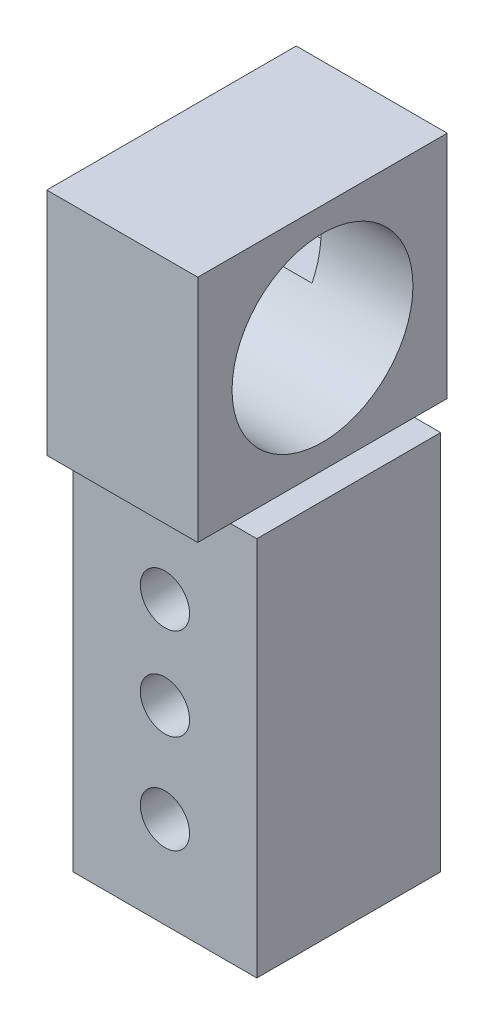
ISO-10303-21;
HEADER;
FILE_DESCRIPTION(('STEP AP214'),'2;1');
FILE_NAME('part.step','',(''),(''),'','','');
FILE_SCHEMA(('AUTOMOTIVE_DESIGN { 1 0 10303 214 1 1 1 1 }'));
ENDSEC;
DATA;
#1=APPLICATION_CONTEXT('core data for automotive mechanical design processes');
#2=APPLICATION_PROTOCOL_DEFINITION('international standard','automotive_design',2000,#1);
#3=PRODUCT_CONTEXT('',#1,'mechanical');
#4=PRODUCT('Part','Part','',(#3));
#5=PRODUCT_RELATED_PRODUCT_CATEGORY('part','',(#4));
#6=PRODUCT_DEFINITION_FORMATION('','',#4);
#7=PRODUCT_DEFINITION_CONTEXT('part definition',#1,'design');
#8=PRODUCT_DEFINITION('design','',#6,#7);
#9=PRODUCT_DEFINITION_SHAPE('','',#8);
#10=(LENGTH_UNIT() NAMED_UNIT(*) SI_UNIT(.MILLI.,.METRE.));
#11=(NAMED_UNIT(*) PLANE_ANGLE_UNIT() SI_UNIT($,.RADIAN.));
#12=(NAMED_UNIT(*) SI_UNIT($,.STERADIAN.) SOLID_ANGLE_UNIT());
#13=UNCERTAINTY_MEASURE_WITH_UNIT(LENGTH_MEASURE(1.E-05),#10,'distance_accuracy_value','');
#14=(GEOMETRIC_REPRESENTATION_CONTEXT(3) GLOBAL_UNCERTAINTY_ASSIGNED_CONTEXT((#13)) GLOBAL_UNIT_ASSIGNED_CONTEXT((#10,
#11,#12)) REPRESENTATION_CONTEXT('',''));
#15=CARTESIAN_POINT('',(0.,0.,0.));
#16=DIRECTION('',(0.,0.,1.));
#17=DIRECTION('',(1.,0.,0.));
#18=AXIS2_PLACEMENT_3D('',#15,#16,#17);
#19=CARTESIAN_POINT('',(0.,0.,0.));
#20=DIRECTION('',(0.,1.,0.));
#21=DIRECTION('',(0.,0.,1.));
#22=AXIS2_PLACEMENT_3D('',#19,#20,#21);
#23=PLANE('',#22);
#24=DIRECTION('',(1.,0.,0.));
#25=VECTOR('',#24,1.);
#26=CARTESIAN_POINT('',(17.78,0.,17.78));
#27=LINE('',#26,#25);
#28=CARTESIAN_POINT('',(-17.78,0.,17.78));
#29=VERTEX_POINT('',#28);
#30=CARTESIAN_POINT('',(-16.51,0.,17.78));
#31=VERTEX_POINT('',#30);
#32=EDGE_CURVE('E242',#29,#31,#27,.T.);
#33=ORIENTED_EDGE('',*,*,#32,.T.);
#34=DIRECTION('',(0.,0.,1.));
#35=VECTOR('',#34,1.);
#36=CARTESIAN_POINT('',(-16.51,0.,-24.13));
#37=LINE('',#36,#35);
#38=CARTESIAN_POINT('',(-16.51,0.,-17.78));
#39=VERTEX_POINT('',#38);
#40=EDGE_CURVE('E279',#39,#31,#37,.T.);
#41=ORIENTED_EDGE('',*,*,#40,.F.);
#42=DIRECTION('',(-1.,0.,0.));
#43=VECTOR('',#42,1.);
#44=CARTESIAN_POINT('',(17.78,0.,-17.78));
#45=LINE('',#44,#43);
#46=CARTESIAN_POINT('',(-17.78,0.,-17.78));
#47=VERTEX_POINT('',#46);
#48=EDGE_CURVE('E248',#39,#47,#45,.T.);
#49=ORIENTED_EDGE('',*,*,#48,.T.);
#50=DIRECTION('',(0.,0.,1.));
#51=VECTOR('',#50,1.);
#52=CARTESIAN_POINT('',(-17.78,0.,17.78));
#53=LINE('',#52,#51);
#54=EDGE_CURVE('E210',#47,#29,#53,.T.);
#55=ORIENTED_EDGE('',*,*,#54,.T.);
#56=EDGE_LOOP('',(#33,#41,#49,#55));
#57=FACE_BOUND('',#56,.T.);
#58=ADVANCED_FACE('F37',(#57),#23,.T.);
#59=CARTESIAN_POINT('',(-17.78,-73.5965,17.78));
#60=DIRECTION('',(-1.,0.,0.));
#61=DIRECTION('',(0.,0.,1.));
#62=AXIS2_PLACEMENT_3D('',#59,#60,#61);
#63=PLANE('',#62);
#64=ORIENTED_EDGE('',*,*,#54,.F.);
#65=DIRECTION('',(0.,1.,0.));
#66=VECTOR('',#65,1.);
#67=CARTESIAN_POINT('',(-17.78,-73.5965,-17.78));
#68=LINE('',#67,#66);
#69=CARTESIAN_POINT('',(-17.78,-73.5965,-17.78));
#70=VERTEX_POINT('',#69);
#71=EDGE_CURVE('E252',#70,#47,#68,.T.);
#72=ORIENTED_EDGE('',*,*,#71,.F.);
#73=DIRECTION('',(0.,0.,1.));
#74=VECTOR('',#73,1.);
#75=CARTESIAN_POINT('',(-17.78,-73.5965,17.78));
#76=LINE('',#75,#74);
#77=CARTESIAN_POINT('',(-17.78,-73.5965,17.78));
#78=VERTEX_POINT('',#77);
#79=EDGE_CURVE('E225',#70,#78,#76,.T.);
#80=ORIENTED_EDGE('',*,*,#79,.T.);
#81=DIRECTION('',(0.,1.,0.));
#82=VECTOR('',#81,1.);
#83=CARTESIAN_POINT('',(-17.78,-73.5965,17.78));
#84=LINE('',#83,#82);
#85=EDGE_CURVE('E238',#78,#29,#84,.T.);
#86=ORIENTED_EDGE('',*,*,#85,.T.);
#87=EDGE_LOOP('',(#64,#72,#80,#86));
#88=FACE_BOUND('',#87,.T.);
#89=ADVANCED_FACE('F39',(#88),#63,.T.);
#90=CARTESIAN_POINT('',(17.78,-73.5965,-17.78));
#91=DIRECTION('',(0.,0.,-1.));
#92=DIRECTION('',(-1.,0.,0.));
#93=AXIS2_PLACEMENT_3D('',#90,#91,#92);
#94=PLANE('',#93);
#95=CARTESIAN_POINT('',(12.7,0.,-17.78));
#96=VERTEX_POINT('',#95);
#97=EDGE_CURVE('E251',#96,#39,#45,.T.);
#98=ORIENTED_EDGE('',*,*,#97,.F.);
#99=CARTESIAN_POINT('',(17.78,0.,-17.78));
#100=VERTEX_POINT('',#99);
#101=EDGE_CURVE('E229',#100,#96,#45,.T.);
#102=ORIENTED_EDGE('',*,*,#101,.F.);
#103=DIRECTION('',(0.,1.,0.));
#104=VECTOR('',#103,1.);
#105=CARTESIAN_POINT('',(17.78,-73.5965,-17.78));
#106=LINE('',#105,#104);
#107=CARTESIAN_POINT('',(17.78,-73.5965,-17.78));
#108=VERTEX_POINT('',#107);
#109=EDGE_CURVE('E256',#108,#100,#106,.T.);
#110=ORIENTED_EDGE('',*,*,#109,.F.);
#111=DIRECTION('',(-1.,0.,0.));
#112=VECTOR('',#111,1.);
#113=CARTESIAN_POINT('',(17.78,-73.5965,-17.78));
#114=LINE('',#113,#112);
#115=EDGE_CURVE('E235',#108,#70,#114,.T.);
#116=ORIENTED_EDGE('',*,*,#115,.T.);
#117=ORIENTED_EDGE('',*,*,#71,.T.);
#118=ORIENTED_EDGE('',*,*,#48,.F.);
#119=EDGE_LOOP('',(#98,#102,#110,#116,#117,#118));
#120=FACE_BOUND('',#119,.T.);
#121=CARTESIAN_POINT('',(0.,-19.05,-17.78));
#122=DIRECTION('',(0.,0.,1.));
#123=DIRECTION('',(1.,0.,0.));
#124=AXIS2_PLACEMENT_3D('',#121,#122,#123);
#125=CIRCLE('',#124,4.7625);
#126=CARTESIAN_POINT('',(4.7625,-19.05,-17.78));
#127=VERTEX_POINT('',#126);
#128=EDGE_CURVE('E207',#127,#127,#125,.T.);
#129=ORIENTED_EDGE('',*,*,#128,.T.);
#130=EDGE_LOOP('',(#129));
#131=FACE_BOUND('',#130,.T.);
#132=CARTESIAN_POINT('',(0.,-36.83,-17.78));
#133=DIRECTION('',(0.,0.,1.));
#134=DIRECTION('',(1.,0.,0.));
#135=AXIS2_PLACEMENT_3D('',#132,#133,#134);
#136=CIRCLE('',#135,4.76250000000001);
#137=CARTESIAN_POINT('',(4.76250000000001,-36.83,-17.78));
#138=VERTEX_POINT('',#137);
#139=EDGE_CURVE('E214',#138,#138,#136,.T.);
#140=ORIENTED_EDGE('',*,*,#139,.T.);
#141=EDGE_LOOP('',(#140));
#142=FACE_BOUND('',#141,.T.);
#143=CARTESIAN_POINT('',(0.,-55.88,-17.78));
#144=DIRECTION('',(0.,0.,1.));
#145=DIRECTION('',(1.,0.,0.));
#146=AXIS2_PLACEMENT_3D('',#143,#144,#145);
#147=CIRCLE('',#146,4.7625);
#148=CARTESIAN_POINT('',(4.7625,-55.88,-17.78));
#149=VERTEX_POINT('',#148);
#150=EDGE_CURVE('E220',#149,#149,#147,.T.);
#151=ORIENTED_EDGE('',*,*,#150,.T.);
#152=EDGE_LOOP('',(#151));
#153=FACE_BOUND('',#152,.T.);
#154=ADVANCED_FACE('F366',(#120,#131,#142,#153),#94,.T.);
#155=CARTESIAN_POINT('',(17.78,-73.5965,17.78));
#156=DIRECTION('',(1.,0.,0.));
#157=DIRECTION('',(0.,0.,-1.));
#158=AXIS2_PLACEMENT_3D('',#155,#156,#157);
#159=PLANE('',#158);
#160=DIRECTION('',(0.,0.,-1.));
#161=VECTOR('',#160,1.);
#162=CARTESIAN_POINT('',(17.78,0.,17.78));
#163=LINE('',#162,#161);
#164=CARTESIAN_POINT('',(17.78,0.,17.78));
#165=VERTEX_POINT('',#164);
#166=EDGE_CURVE('E245',#165,#100,#163,.T.);
#167=ORIENTED_EDGE('',*,*,#166,.F.);
#168=DIRECTION('',(0.,1.,0.));
#169=VECTOR('',#168,1.);
#170=CARTESIAN_POINT('',(17.78,-73.5965,17.78));
#171=LINE('',#170,#169);
#172=CARTESIAN_POINT('',(17.78,-73.5965,17.78));
#173=VERTEX_POINT('',#172);
#174=EDGE_CURVE('E258',#173,#165,#171,.T.);
#175=ORIENTED_EDGE('',*,*,#174,.F.);
#176=DIRECTION('',(0.,0.,-1.));
#177=VECTOR('',#176,1.);
#178=CARTESIAN_POINT('',(17.78,-73.5965,17.78));
#179=LINE('',#178,#177);
#180=EDGE_CURVE('E232',#173,#108,#179,.T.);
#181=ORIENTED_EDGE('',*,*,#180,.T.);
#182=ORIENTED_EDGE('',*,*,#109,.T.);
#183=EDGE_LOOP('',(#167,#175,#181,#182));
#184=FACE_BOUND('',#183,.T.);
#185=ADVANCED_FACE('F417',(#184),#159,.T.);
#186=CARTESIAN_POINT('',(17.78,-73.5965,17.78));
#187=DIRECTION('',(0.,0.,1.));
#188=DIRECTION('',(1.,0.,0.));
#189=AXIS2_PLACEMENT_3D('',#186,#187,#188);
#190=PLANE('',#189);
#191=DIRECTION('',(1.,0.,0.));
#192=VECTOR('',#191,1.);
#193=CARTESIAN_POINT('',(-12.7,0.,17.78));
#194=LINE('',#193,#192);
#195=CARTESIAN_POINT('',(12.7,0.,17.78));
#196=VERTEX_POINT('',#195);
#197=EDGE_CURVE('E188',#31,#196,#194,.T.);
#198=ORIENTED_EDGE('',*,*,#197,.F.);
#199=ORIENTED_EDGE('',*,*,#32,.F.);
#200=ORIENTED_EDGE('',*,*,#85,.F.);
#201=DIRECTION('',(1.,0.,0.));
#202=VECTOR('',#201,1.);
#203=CARTESIAN_POINT('',(17.78,-73.5965,17.78));
#204=LINE('',#203,#202);
#205=EDGE_CURVE('E228',#78,#173,#204,.T.);
#206=ORIENTED_EDGE('',*,*,#205,.T.);
#207=ORIENTED_EDGE('',*,*,#174,.T.);
#208=EDGE_CURVE('E241',#196,#165,#27,.T.);
#209=ORIENTED_EDGE('',*,*,#208,.F.);
#210=EDGE_LOOP('',(#198,#199,#200,#206,#207,#209));
#211=FACE_BOUND('',#210,.T.);
#212=CARTESIAN_POINT('',(0.,-19.05,17.78));
#213=DIRECTION('',(0.,0.,1.));
#214=DIRECTION('',(1.,0.,0.));
#215=AXIS2_PLACEMENT_3D('',#212,#213,#214);
#216=CIRCLE('',#215,4.7625);
#217=CARTESIAN_POINT('',(4.7625,-19.05,17.78));
#218=VERTEX_POINT('',#217);
#219=EDGE_CURVE('E211',#218,#218,#216,.T.);
#220=ORIENTED_EDGE('',*,*,#219,.F.);
#221=EDGE_LOOP('',(#220));
#222=FACE_BOUND('',#221,.T.);
#223=CARTESIAN_POINT('',(0.,-36.83,17.78));
#224=DIRECTION('',(0.,0.,1.));
#225=DIRECTION('',(1.,0.,0.));
#226=AXIS2_PLACEMENT_3D('',#223,#224,#225);
#227=CIRCLE('',#226,4.76250000000001);
#228=CARTESIAN_POINT('',(4.76250000000001,-36.83,17.78));
#229=VERTEX_POINT('',#228);
#230=EDGE_CURVE('E217',#229,#229,#227,.T.);
#231=ORIENTED_EDGE('',*,*,#230,.F.);
#232=EDGE_LOOP('',(#231));
#233=FACE_BOUND('',#232,.T.);
#234=CARTESIAN_POINT('',(0.,-55.88,17.78));
#235=DIRECTION('',(0.,0.,1.));
#236=DIRECTION('',(1.,0.,0.));
#237=AXIS2_PLACEMENT_3D('',#234,#235,#236);
#238=CIRCLE('',#237,4.7625);
#239=CARTESIAN_POINT('',(4.7625,-55.88,17.78));
#240=VERTEX_POINT('',#239);
#241=EDGE_CURVE('E204',#240,#240,#238,.T.);
#242=ORIENTED_EDGE('',*,*,#241,.F.);
#243=EDGE_LOOP('',(#242));
#244=FACE_BOUND('',#243,.T.);
#245=ADVANCED_FACE('F381',(#211,#222,#233,#244),#190,.T.);
#246=CARTESIAN_POINT('',(0.,-73.5965,0.));
#247=DIRECTION('',(0.,1.,0.));
#248=DIRECTION('',(0.,0.,1.));
#249=AXIS2_PLACEMENT_3D('',#246,#247,#248);
#250=PLANE('',#249);
#251=ORIENTED_EDGE('',*,*,#79,.F.);
#252=ORIENTED_EDGE('',*,*,#115,.F.);
#253=ORIENTED_EDGE('',*,*,#180,.F.);
#254=ORIENTED_EDGE('',*,*,#205,.F.);
#255=EDGE_LOOP('',(#251,#252,#253,#254));
#256=FACE_BOUND('',#255,.T.);
#257=ADVANCED_FACE('F372',(#256),#250,.F.);
#258=DIRECTION('',(0.,0.,-1.));
#259=VECTOR('',#258,1.);
#260=CARTESIAN_POINT('',(12.7,0.,-17.78));
#261=LINE('',#260,#259);
#262=EDGE_CURVE('E201',#196,#96,#261,.T.);
#263=ORIENTED_EDGE('',*,*,#262,.F.);
#264=ORIENTED_EDGE('',*,*,#208,.T.);
#265=ORIENTED_EDGE('',*,*,#166,.T.);
#266=ORIENTED_EDGE('',*,*,#101,.T.);
#267=EDGE_LOOP('',(#263,#264,#265,#266));
#268=FACE_BOUND('',#267,.T.);
#269=ADVANCED_FACE('F362',(#268),#23,.T.);
#270=CARTESIAN_POINT('',(0.,-55.88,-17.78));
#271=DIRECTION('',(0.,0.,1.));
#272=DIRECTION('',(1.,0.,0.));
#273=AXIS2_PLACEMENT_3D('',#270,#271,#272);
#274=CYLINDRICAL_SURFACE('',#273,4.7625);
#275=ORIENTED_EDGE('',*,*,#150,.F.);
#276=EDGE_LOOP('',(#275));
#277=FACE_BOUND('',#276,.T.);
#278=ORIENTED_EDGE('',*,*,#241,.T.);
#279=EDGE_LOOP('',(#278));
#280=FACE_BOUND('',#279,.T.);
#281=ADVANCED_FACE('F371',(#277,#280),#274,.F.);
#282=CARTESIAN_POINT('',(0.,-36.83,-17.78));
#283=DIRECTION('',(0.,0.,1.));
#284=DIRECTION('',(1.,0.,0.));
#285=AXIS2_PLACEMENT_3D('',#282,#283,#284);
#286=CYLINDRICAL_SURFACE('',#285,4.76250000000001);
#287=ORIENTED_EDGE('',*,*,#139,.F.);
#288=EDGE_LOOP('',(#287));
#289=FACE_BOUND('',#288,.T.);
#290=ORIENTED_EDGE('',*,*,#230,.T.);
#291=EDGE_LOOP('',(#290));
#292=FACE_BOUND('',#291,.T.);
#293=ADVANCED_FACE('F378',(#289,#292),#286,.F.);
#294=CARTESIAN_POINT('',(0.,-19.05,-17.78));
#295=DIRECTION('',(0.,0.,1.));
#296=DIRECTION('',(1.,0.,0.));
#297=AXIS2_PLACEMENT_3D('',#294,#295,#296);
#298=CYLINDRICAL_SURFACE('',#297,4.7625);
#299=ORIENTED_EDGE('',*,*,#128,.F.);
#300=EDGE_LOOP('',(#299));
#301=FACE_BOUND('',#300,.T.);
#302=ORIENTED_EDGE('',*,*,#219,.T.);
#303=EDGE_LOOP('',(#302));
#304=FACE_BOUND('',#303,.T.);
#305=ADVANCED_FACE('F459',(#301,#304),#298,.F.);
#306=CARTESIAN_POINT('',(12.7,44.45,-17.78));
#307=DIRECTION('',(-1.,0.,0.));
#308=DIRECTION('',(0.,0.,1.));
#309=AXIS2_PLACEMENT_3D('',#306,#307,#308);
#310=PLANE('',#309);
#311=CARTESIAN_POINT('',(12.7,22.225,0.));
#312=DIRECTION('',(1.,0.,0.));
#313=DIRECTION('',(0.,0.,-1.));
#314=AXIS2_PLACEMENT_3D('',#311,#312,#313);
#315=CIRCLE('',#314,17.500000052);
#316=CARTESIAN_POINT('',(12.7,22.225,-17.500000052));
#317=VERTEX_POINT('',#316);
#318=EDGE_CURVE('E170',#317,#317,#315,.T.);
#319=ORIENTED_EDGE('',*,*,#318,.F.);
#320=EDGE_LOOP('',(#319));
#321=FACE_BOUND('',#320,.T.);
#322=ORIENTED_EDGE('',*,*,#262,.T.);
#323=DIRECTION('',(0.,0.,1.));
#324=VECTOR('',#323,1.);
#325=CARTESIAN_POINT('',(12.7,0.,-24.13));
#326=LINE('',#325,#324);
#327=CARTESIAN_POINT('',(12.7,0.,-24.13));
#328=VERTEX_POINT('',#327);
#329=EDGE_CURVE('E185',#328,#96,#326,.T.);
#330=ORIENTED_EDGE('',*,*,#329,.F.);
#331=DIRECTION('',(0.,-1.,0.));
#332=VECTOR('',#331,1.);
#333=CARTESIAN_POINT('',(12.7,44.45,-24.13));
#334=LINE('',#333,#332);
#335=CARTESIAN_POINT('',(12.7,44.45,-24.13));
#336=VERTEX_POINT('',#335);
#337=EDGE_CURVE('E169',#336,#328,#334,.T.);
#338=ORIENTED_EDGE('',*,*,#337,.F.);
#339=DIRECTION('',(0.,0.,-1.));
#340=VECTOR('',#339,1.);
#341=CARTESIAN_POINT('',(12.7,44.45,-17.78));
#342=LINE('',#341,#340);
#343=CARTESIAN_POINT('',(12.7,44.45,24.13));
#344=VERTEX_POINT('',#343);
#345=EDGE_CURVE('E202',#344,#336,#342,.T.);
#346=ORIENTED_EDGE('',*,*,#345,.F.);
#347=DIRECTION('',(0.,1.,0.));
#348=VECTOR('',#347,1.);
#349=CARTESIAN_POINT('',(12.7,44.45,24.13));
#350=LINE('',#349,#348);
#351=CARTESIAN_POINT('',(12.7,0.,24.13));
#352=VERTEX_POINT('',#351);
#353=EDGE_CURVE('E191',#352,#344,#350,.T.);
#354=ORIENTED_EDGE('',*,*,#353,.F.);
#355=DIRECTION('',(0.,0.,-1.));
#356=VECTOR('',#355,1.);
#357=CARTESIAN_POINT('',(12.7,0.,24.13));
#358=LINE('',#357,#356);
#359=EDGE_CURVE('E196',#352,#196,#358,.T.);
#360=ORIENTED_EDGE('',*,*,#359,.T.);
#361=EDGE_LOOP('',(#322,#330,#338,#346,#354,#360));
#362=FACE_BOUND('',#361,.T.);
#363=ADVANCED_FACE('F396',(#321,#362),#310,.F.);
#364=CARTESIAN_POINT('',(0.,44.45,0.));
#365=DIRECTION('',(0.,-1.,0.));
#366=DIRECTION('',(0.,0.,-1.));
#367=AXIS2_PLACEMENT_3D('',#364,#365,#366);
#368=PLANE('',#367);
#369=DIRECTION('',(1.,0.,0.));
#370=VECTOR('',#369,1.);
#371=CARTESIAN_POINT('',(12.7,44.45,-24.13));
#372=LINE('',#371,#370);
#373=CARTESIAN_POINT('',(-16.51,44.45,-24.13));
#374=VERTEX_POINT('',#373);
#375=EDGE_CURVE('E182',#374,#336,#372,.T.);
#376=ORIENTED_EDGE('',*,*,#375,.F.);
#377=DIRECTION('',(0.,0.,-1.));
#378=VECTOR('',#377,1.);
#379=CARTESIAN_POINT('',(-16.51,44.45,-24.13));
#380=LINE('',#379,#378);
#381=CARTESIAN_POINT('',(-16.51,44.45,24.13));
#382=VERTEX_POINT('',#381);
#383=EDGE_CURVE('E293',#382,#374,#380,.T.);
#384=ORIENTED_EDGE('',*,*,#383,.F.);
#385=DIRECTION('',(-1.,0.,0.));
#386=VECTOR('',#385,1.);
#387=CARTESIAN_POINT('',(-12.7,44.45,24.13));
#388=LINE('',#387,#386);
#389=EDGE_CURVE('E194',#344,#382,#388,.T.);
#390=ORIENTED_EDGE('',*,*,#389,.F.);
#391=ORIENTED_EDGE('',*,*,#345,.T.);
#392=EDGE_LOOP('',(#376,#384,#390,#391));
#393=FACE_BOUND('',#392,.T.);
#394=ADVANCED_FACE('F404',(#393),#368,.F.);
#395=CARTESIAN_POINT('',(-12.7,0.,24.13));
#396=DIRECTION('',(0.,1.,0.));
#397=DIRECTION('',(0.,0.,1.));
#398=AXIS2_PLACEMENT_3D('',#395,#396,#397);
#399=PLANE('',#398);
#400=ORIENTED_EDGE('',*,*,#197,.T.);
#401=ORIENTED_EDGE('',*,*,#359,.F.);
#402=DIRECTION('',(1.,0.,0.));
#403=VECTOR('',#402,1.);
#404=CARTESIAN_POINT('',(-12.7,0.,24.13));
#405=LINE('',#404,#403);
#406=CARTESIAN_POINT('',(-16.51,0.,24.13));
#407=VERTEX_POINT('',#406);
#408=EDGE_CURVE('E189',#407,#352,#405,.T.);
#409=ORIENTED_EDGE('',*,*,#408,.F.);
#410=EDGE_CURVE('E281',#31,#407,#37,.T.);
#411=ORIENTED_EDGE('',*,*,#410,.F.);
#412=EDGE_LOOP('',(#400,#401,#409,#411));
#413=FACE_BOUND('',#412,.T.);
#414=ADVANCED_FACE('F390',(#413),#399,.F.);
#415=CARTESIAN_POINT('',(0.,0.,24.13));
#416=DIRECTION('',(0.,0.,1.));
#417=DIRECTION('',(1.,0.,0.));
#418=AXIS2_PLACEMENT_3D('',#415,#416,#417);
#419=PLANE('',#418);
#420=ORIENTED_EDGE('',*,*,#389,.T.);
#421=DIRECTION('',(0.,1.,0.));
#422=VECTOR('',#421,1.);
#423=CARTESIAN_POINT('',(-16.51,0.,24.13));
#424=LINE('',#423,#422);
#425=EDGE_CURVE('E295',#407,#382,#424,.T.);
#426=ORIENTED_EDGE('',*,*,#425,.F.);
#427=ORIENTED_EDGE('',*,*,#408,.T.);
#428=ORIENTED_EDGE('',*,*,#353,.T.);
#429=EDGE_LOOP('',(#420,#426,#427,#428));
#430=FACE_BOUND('',#429,.T.);
#431=ADVANCED_FACE('F400',(#430),#419,.T.);
#432=CARTESIAN_POINT('',(12.7,0.,-24.13));
#433=DIRECTION('',(0.,1.,0.));
#434=DIRECTION('',(0.,0.,1.));
#435=AXIS2_PLACEMENT_3D('',#432,#433,#434);
#436=PLANE('',#435);
#437=ORIENTED_EDGE('',*,*,#329,.T.);
#438=ORIENTED_EDGE('',*,*,#97,.T.);
#439=CARTESIAN_POINT('',(-16.51,0.,-24.13));
#440=VERTEX_POINT('',#439);
#441=EDGE_CURVE('E275',#440,#39,#37,.T.);
#442=ORIENTED_EDGE('',*,*,#441,.F.);
#443=DIRECTION('',(-1.,0.,0.));
#444=VECTOR('',#443,1.);
#445=CARTESIAN_POINT('',(12.7,0.,-24.13));
#446=LINE('',#445,#444);
#447=EDGE_CURVE('E173',#328,#440,#446,.T.);
#448=ORIENTED_EDGE('',*,*,#447,.F.);
#449=EDGE_LOOP('',(#437,#438,#442,#448));
#450=FACE_BOUND('',#449,.T.);
#451=ADVANCED_FACE('F527',(#450),#436,.F.);
#452=CARTESIAN_POINT('',(0.,0.,-24.13));
#453=DIRECTION('',(0.,0.,-1.));
#454=DIRECTION('',(-1.,0.,0.));
#455=AXIS2_PLACEMENT_3D('',#452,#453,#454);
#456=PLANE('',#455);
#457=DIRECTION('',(0.,-1.,0.));
#458=VECTOR('',#457,1.);
#459=CARTESIAN_POINT('',(-16.51,0.,-24.13));
#460=LINE('',#459,#458);
#461=CARTESIAN_POINT('',(-16.51,14.605,-24.13));
#462=VERTEX_POINT('',#461);
#463=EDGE_CURVE('E289',#462,#440,#460,.T.);
#464=ORIENTED_EDGE('',*,*,#463,.F.);
#465=DIRECTION('',(-1.,0.,0.));
#466=VECTOR('',#465,1.);
#467=CARTESIAN_POINT('',(-5.08000000000002,14.605,-24.13));
#468=LINE('',#467,#466);
#469=CARTESIAN_POINT('',(-5.08000000000002,14.605,-24.13));
#470=VERTEX_POINT('',#469);
#471=EDGE_CURVE('E266',#470,#462,#468,.T.);
#472=ORIENTED_EDGE('',*,*,#471,.F.);
#473=DIRECTION('',(0.,-1.,0.));
#474=VECTOR('',#473,1.);
#475=CARTESIAN_POINT('',(-5.08000000000002,29.845,-24.13));
#476=LINE('',#475,#474);
#477=CARTESIAN_POINT('',(-5.08000000000002,29.845,-24.13));
#478=VERTEX_POINT('',#477);
#479=EDGE_CURVE('E264',#478,#470,#476,.T.);
#480=ORIENTED_EDGE('',*,*,#479,.F.);
#481=DIRECTION('',(-1.,0.,0.));
#482=VECTOR('',#481,1.);
#483=CARTESIAN_POINT('',(-5.08000000000002,29.845,-24.13));
#484=LINE('',#483,#482);
#485=CARTESIAN_POINT('',(-16.51,29.845,-24.13));
#486=VERTEX_POINT('',#485);
#487=EDGE_CURVE('E176',#478,#486,#484,.T.);
#488=ORIENTED_EDGE('',*,*,#487,.T.);
#489=EDGE_CURVE('E292',#374,#486,#460,.T.);
#490=ORIENTED_EDGE('',*,*,#489,.F.);
#491=ORIENTED_EDGE('',*,*,#375,.T.);
#492=ORIENTED_EDGE('',*,*,#337,.T.);
#493=ORIENTED_EDGE('',*,*,#447,.T.);
#494=EDGE_LOOP('',(#464,#472,#480,#488,#490,#491,#492,#493));
#495=FACE_BOUND('',#494,.T.);
#496=ADVANCED_FACE('F274',(#495),#456,.T.);
#497=CARTESIAN_POINT('',(-17.78,22.225,0.));
#498=DIRECTION('',(1.,0.,0.));
#499=DIRECTION('',(0.,0.,-1.));
#500=AXIS2_PLACEMENT_3D('',#497,#498,#499);
#501=CYLINDRICAL_SURFACE('',#500,17.500000052);
#502=CARTESIAN_POINT('',(-12.7,22.225,0.));
#503=DIRECTION('',(1.,0.,0.));
#504=DIRECTION('',(0.,0.,-1.));
#505=AXIS2_PLACEMENT_3D('',#502,#503,#504);
#506=CIRCLE('',#505,17.500000052);
#507=CARTESIAN_POINT('',(-12.7,29.845,-15.7539075095673));
#508=VERTEX_POINT('',#507);
#509=CARTESIAN_POINT('',(-12.7,14.605,-15.7539075095673));
#510=VERTEX_POINT('',#509);
#511=EDGE_CURVE('E157',#508,#510,#506,.T.);
#512=ORIENTED_EDGE('',*,*,#511,.F.);
#513=DIRECTION('',(1.,0.,0.));
#514=VECTOR('',#513,1.);
#515=CARTESIAN_POINT('',(-17.78,29.845,-15.7539075095673));
#516=LINE('',#515,#514);
#517=CARTESIAN_POINT('',(-5.08000000000002,29.845,-15.7539075095673));
#518=VERTEX_POINT('',#517);
#519=EDGE_CURVE('E12',#508,#518,#516,.T.);
#520=ORIENTED_EDGE('',*,*,#519,.T.);
#521=CARTESIAN_POINT('',(-5.08000000000002,22.225,0.));
#522=DIRECTION('',(-1.,0.,0.));
#523=DIRECTION('',(0.,0.,1.));
#524=AXIS2_PLACEMENT_3D('',#521,#522,#523);
#525=CIRCLE('',#524,17.500000052);
#526=CARTESIAN_POINT('',(-5.08000000000002,14.605,-15.7539075095673));
#527=VERTEX_POINT('',#526);
#528=EDGE_CURVE('E255',#527,#518,#525,.F.);
#529=ORIENTED_EDGE('',*,*,#528,.F.);
#530=DIRECTION('',(1.,0.,0.));
#531=VECTOR('',#530,1.);
#532=CARTESIAN_POINT('',(-17.78,14.605,-15.7539075095673));
#533=LINE('',#532,#531);
#534=EDGE_CURVE('E45',#527,#510,#533,.F.);
#535=ORIENTED_EDGE('',*,*,#534,.T.);
#536=EDGE_LOOP('',(#512,#520,#529,#535));
#537=FACE_BOUND('',#536,.T.);
#538=ORIENTED_EDGE('',*,*,#318,.T.);
#539=EDGE_LOOP('',(#538));
#540=FACE_BOUND('',#539,.T.);
#541=ADVANCED_FACE('F167',(#537,#540),#501,.F.);
#542=CARTESIAN_POINT('',(-5.08000000000002,29.845,-24.13));
#543=DIRECTION('',(0.,1.,0.));
#544=DIRECTION('',(0.,0.,1.));
#545=AXIS2_PLACEMENT_3D('',#542,#543,#544);
#546=PLANE('',#545);
#547=ORIENTED_EDGE('',*,*,#519,.F.);
#548=DIRECTION('',(1.,0.,0.));
#549=VECTOR('',#548,1.);
#550=CARTESIAN_POINT('',(-33.9001272395657,29.845,-15.7539075095673));
#551=LINE('',#550,#549);
#552=CARTESIAN_POINT('',(-16.51,29.845,-15.7539075095673));
#553=VERTEX_POINT('',#552);
#554=EDGE_CURVE('E52',#553,#508,#551,.T.);
#555=ORIENTED_EDGE('',*,*,#554,.F.);
#556=DIRECTION('',(0.,0.,-1.));
#557=VECTOR('',#556,1.);
#558=CARTESIAN_POINT('',(-16.51,29.845,-24.13));
#559=LINE('',#558,#557);
#560=EDGE_CURVE('E268',#553,#486,#559,.T.);
#561=ORIENTED_EDGE('',*,*,#560,.T.);
#562=ORIENTED_EDGE('',*,*,#487,.F.);
#563=DIRECTION('',(0.,0.,-1.));
#564=VECTOR('',#563,1.);
#565=CARTESIAN_POINT('',(-5.08000000000002,29.845,-24.13));
#566=LINE('',#565,#564);
#567=EDGE_CURVE('E164',#518,#478,#566,.T.);
#568=ORIENTED_EDGE('',*,*,#567,.F.);
#569=EDGE_LOOP('',(#547,#555,#561,#562,#568));
#570=FACE_BOUND('',#569,.T.);
#571=ADVANCED_FACE('F162',(#570),#546,.F.);
#572=CARTESIAN_POINT('',(-5.08000000000002,14.605,-24.13));
#573=DIRECTION('',(0.,-1.,0.));
#574=DIRECTION('',(0.,0.,-1.));
#575=AXIS2_PLACEMENT_3D('',#572,#573,#574);
#576=PLANE('',#575);
#577=DIRECTION('',(0.,0.,1.));
#578=VECTOR('',#577,1.);
#579=CARTESIAN_POINT('',(-5.08000000000002,14.605,-24.13));
#580=LINE('',#579,#578);
#581=EDGE_CURVE('E60',#470,#527,#580,.T.);
#582=ORIENTED_EDGE('',*,*,#581,.F.);
#583=ORIENTED_EDGE('',*,*,#471,.T.);
#584=DIRECTION('',(0.,0.,1.));
#585=VECTOR('',#584,1.);
#586=CARTESIAN_POINT('',(-16.51,14.605,-24.13));
#587=LINE('',#586,#585);
#588=CARTESIAN_POINT('',(-16.51,14.605,-15.7539075095673));
#589=VERTEX_POINT('',#588);
#590=EDGE_CURVE('E286',#462,#589,#587,.T.);
#591=ORIENTED_EDGE('',*,*,#590,.T.);
#592=DIRECTION('',(1.,0.,0.));
#593=VECTOR('',#592,1.);
#594=CARTESIAN_POINT('',(-33.9001272395657,14.605,-15.7539075095673));
#595=LINE('',#594,#593);
#596=EDGE_CURVE('E152',#589,#510,#595,.T.);
#597=ORIENTED_EDGE('',*,*,#596,.T.);
#598=ORIENTED_EDGE('',*,*,#534,.F.);
#599=EDGE_LOOP('',(#582,#583,#591,#597,#598));
#600=FACE_BOUND('',#599,.T.);
#601=ADVANCED_FACE('F285',(#600),#576,.F.);
#602=CARTESIAN_POINT('',(-5.08000000000002,0.,0.));
#603=DIRECTION('',(-1.,0.,0.));
#604=DIRECTION('',(0.,0.,1.));
#605=AXIS2_PLACEMENT_3D('',#602,#603,#604);
#606=PLANE('',#605);
#607=ORIENTED_EDGE('',*,*,#528,.T.);
#608=ORIENTED_EDGE('',*,*,#567,.T.);
#609=ORIENTED_EDGE('',*,*,#479,.T.);
#610=ORIENTED_EDGE('',*,*,#581,.T.);
#611=EDGE_LOOP('',(#607,#608,#609,#610));
#612=FACE_BOUND('',#611,.T.);
#613=ADVANCED_FACE('F262',(#612),#606,.T.);
#614=CARTESIAN_POINT('',(-12.7,0.,0.));
#615=DIRECTION('',(1.,0.,0.));
#616=DIRECTION('',(0.,0.,-1.));
#617=AXIS2_PLACEMENT_3D('',#614,#615,#616);
#618=PLANE('',#617);
#619=CARTESIAN_POINT('',(-12.7,13.462,-8.88999999999999));
#620=DIRECTION('',(1.,0.,0.));
#621=DIRECTION('',(0.,0.,-1.));
#622=AXIS2_PLACEMENT_3D('',#619,#620,#621);
#623=CIRCLE('',#622,1.5);
#624=CARTESIAN_POINT('',(-12.7,13.462,-10.39));
#625=VERTEX_POINT('',#624);
#626=EDGE_CURVE('E314',#625,#625,#623,.F.);
#627=ORIENTED_EDGE('',*,*,#626,.T.);
#628=EDGE_LOOP('',(#627));
#629=FACE_BOUND('',#628,.T.);
#630=CARTESIAN_POINT('',(-12.7,30.988,8.89));
#631=DIRECTION('',(1.,0.,0.));
#632=DIRECTION('',(0.,0.,-1.));
#633=AXIS2_PLACEMENT_3D('',#630,#631,#632);
#634=CIRCLE('',#633,1.5);
#635=CARTESIAN_POINT('',(-12.7,30.988,7.39));
#636=VERTEX_POINT('',#635);
#637=EDGE_CURVE('E315',#636,#636,#634,.F.);
#638=ORIENTED_EDGE('',*,*,#637,.T.);
#639=EDGE_LOOP('',(#638));
#640=FACE_BOUND('',#639,.T.);
#641=CARTESIAN_POINT('',(-12.7,15.494,6.604));
#642=DIRECTION('',(1.,0.,0.));
#643=DIRECTION('',(0.,0.,-1.));
#644=AXIS2_PLACEMENT_3D('',#641,#642,#643);
#645=CIRCLE('',#644,1.5);
#646=CARTESIAN_POINT('',(-12.7,15.494,5.10399999999999));
#647=VERTEX_POINT('',#646);
#648=EDGE_CURVE('E322',#647,#647,#645,.F.);
#649=ORIENTED_EDGE('',*,*,#648,.T.);
#650=EDGE_LOOP('',(#649));
#651=FACE_BOUND('',#650,.T.);
#652=CARTESIAN_POINT('',(-12.7,28.956,-6.604));
#653=DIRECTION('',(1.,0.,0.));
#654=DIRECTION('',(0.,0.,-1.));
#655=AXIS2_PLACEMENT_3D('',#652,#653,#654);
#656=CIRCLE('',#655,1.5);
#657=CARTESIAN_POINT('',(-12.7,28.956,-8.104));
#658=VERTEX_POINT('',#657);
#659=EDGE_CURVE('E308',#658,#658,#656,.F.);
#660=ORIENTED_EDGE('',*,*,#659,.T.);
#661=EDGE_LOOP('',(#660));
#662=FACE_BOUND('',#661,.T.);
#663=CARTESIAN_POINT('',(-12.7,21.9022861035869,0.));
#664=DIRECTION('',(1.,0.,0.));
#665=DIRECTION('',(0.,0.,-1.));
#666=AXIS2_PLACEMENT_3D('',#663,#664,#665);
#667=CIRCLE('',#666,5.588);
#668=CARTESIAN_POINT('',(-12.7,21.9022861035869,-5.588));
#669=VERTEX_POINT('',#668);
#670=EDGE_CURVE('E159',#669,#669,#667,.F.);
#671=ORIENTED_EDGE('',*,*,#670,.T.);
#672=EDGE_LOOP('',(#671));
#673=FACE_BOUND('',#672,.T.);
#674=DIRECTION('',(0.,-1.,0.));
#675=VECTOR('',#674,1.);
#676=CARTESIAN_POINT('',(-12.7,14.605,-15.7539075095673));
#677=LINE('',#676,#675);
#678=EDGE_CURVE('E147',#508,#510,#677,.T.);
#679=ORIENTED_EDGE('',*,*,#678,.F.);
#680=ORIENTED_EDGE('',*,*,#511,.T.);
#681=EDGE_LOOP('',(#679,#680));
#682=FACE_BOUND('',#681,.T.);
#683=ADVANCED_FACE('F155',(#629,#640,#651,#662,#673,#682),#618,.T.);
#684=CARTESIAN_POINT('',(-16.51,0.,0.));
#685=DIRECTION('',(1.,0.,0.));
#686=DIRECTION('',(0.,0.,-1.));
#687=AXIS2_PLACEMENT_3D('',#684,#685,#686);
#688=PLANE('',#687);
#689=CARTESIAN_POINT('',(-16.51,13.462,-8.88999999999999));
#690=DIRECTION('',(-1.,0.,0.));
#691=DIRECTION('',(0.,0.,1.));
#692=AXIS2_PLACEMENT_3D('',#689,#690,#691);
#693=CIRCLE('',#692,1.5);
#694=CARTESIAN_POINT('',(-16.51,13.462,-7.38999999999999));
#695=VERTEX_POINT('',#694);
#696=EDGE_CURVE('E318',#695,#695,#693,.T.);
#697=ORIENTED_EDGE('',*,*,#696,.F.);
#698=EDGE_LOOP('',(#697));
#699=FACE_BOUND('',#698,.T.);
#700=CARTESIAN_POINT('',(-16.51,30.988,8.89));
#701=DIRECTION('',(-1.,0.,0.));
#702=DIRECTION('',(0.,0.,1.));
#703=AXIS2_PLACEMENT_3D('',#700,#701,#702);
#704=CIRCLE('',#703,1.5);
#705=CARTESIAN_POINT('',(-16.51,30.988,10.39));
#706=VERTEX_POINT('',#705);
#707=EDGE_CURVE('E319',#706,#706,#704,.T.);
#708=ORIENTED_EDGE('',*,*,#707,.F.);
#709=EDGE_LOOP('',(#708));
#710=FACE_BOUND('',#709,.T.);
#711=CARTESIAN_POINT('',(-16.51,15.494,6.604));
#712=DIRECTION('',(-1.,0.,0.));
#713=DIRECTION('',(0.,0.,1.));
#714=AXIS2_PLACEMENT_3D('',#711,#712,#713);
#715=CIRCLE('',#714,1.5);
#716=CARTESIAN_POINT('',(-16.51,15.494,8.104));
#717=VERTEX_POINT('',#716);
#718=EDGE_CURVE('E329',#717,#717,#715,.T.);
#719=ORIENTED_EDGE('',*,*,#718,.F.);
#720=EDGE_LOOP('',(#719));
#721=FACE_BOUND('',#720,.T.);
#722=CARTESIAN_POINT('',(-16.51,28.956,-6.60399999999999));
#723=DIRECTION('',(-1.,0.,0.));
#724=DIRECTION('',(0.,0.,1.));
#725=AXIS2_PLACEMENT_3D('',#722,#723,#724);
#726=CIRCLE('',#725,1.5);
#727=CARTESIAN_POINT('',(-16.51,28.956,-5.10399999999999));
#728=VERTEX_POINT('',#727);
#729=EDGE_CURVE('E311',#728,#728,#726,.T.);
#730=ORIENTED_EDGE('',*,*,#729,.F.);
#731=EDGE_LOOP('',(#730));
#732=FACE_BOUND('',#731,.T.);
#733=CARTESIAN_POINT('',(-16.51,21.9022861035869,0.));
#734=DIRECTION('',(-1.,0.,0.));
#735=DIRECTION('',(0.,0.,1.));
#736=AXIS2_PLACEMENT_3D('',#733,#734,#735);
#737=CIRCLE('',#736,5.588);
#738=CARTESIAN_POINT('',(-16.51,21.9022861035869,5.588));
#739=VERTEX_POINT('',#738);
#740=EDGE_CURVE('E305',#739,#739,#737,.T.);
#741=ORIENTED_EDGE('',*,*,#740,.F.);
#742=EDGE_LOOP('',(#741));
#743=FACE_BOUND('',#742,.T.);
#744=DIRECTION('',(0.,1.,0.));
#745=VECTOR('',#744,1.);
#746=CARTESIAN_POINT('',(-16.51,14.605,-15.7539075095673));
#747=LINE('',#746,#745);
#748=EDGE_CURVE('E150',#589,#553,#747,.T.);
#749=ORIENTED_EDGE('',*,*,#748,.F.);
#750=ORIENTED_EDGE('',*,*,#590,.F.);
#751=ORIENTED_EDGE('',*,*,#463,.T.);
#752=ORIENTED_EDGE('',*,*,#441,.T.);
#753=ORIENTED_EDGE('',*,*,#40,.T.);
#754=ORIENTED_EDGE('',*,*,#410,.T.);
#755=ORIENTED_EDGE('',*,*,#425,.T.);
#756=ORIENTED_EDGE('',*,*,#383,.T.);
#757=ORIENTED_EDGE('',*,*,#489,.T.);
#758=ORIENTED_EDGE('',*,*,#560,.F.);
#759=EDGE_LOOP('',(#749,#750,#751,#752,#753,#754,#755,#756,#757,#758));
#760=FACE_BOUND('',#759,.T.);
#761=ADVANCED_FACE('F288',(#699,#710,#721,#732,#743,#760),#688,.F.);
#762=CARTESIAN_POINT('',(-33.9001272395657,14.605,-15.7539075095673));
#763=DIRECTION('',(0.,0.,1.));
#764=DIRECTION('',(1.,0.,0.));
#765=AXIS2_PLACEMENT_3D('',#762,#763,#764);
#766=PLANE('',#765);
#767=ORIENTED_EDGE('',*,*,#748,.T.);
#768=ORIENTED_EDGE('',*,*,#554,.T.);
#769=ORIENTED_EDGE('',*,*,#678,.T.);
#770=ORIENTED_EDGE('',*,*,#596,.F.);
#771=EDGE_LOOP('',(#767,#768,#769,#770));
#772=FACE_BOUND('',#771,.T.);
#773=ADVANCED_FACE('F145',(#772),#766,.F.);
#774=CARTESIAN_POINT('',(3.10525077308169,21.9022861035869,0.));
#775=DIRECTION('',(-1.,0.,0.));
#776=DIRECTION('',(0.,0.,1.));
#777=AXIS2_PLACEMENT_3D('',#774,#775,#776);
#778=CYLINDRICAL_SURFACE('',#777,5.588);
#779=ORIENTED_EDGE('',*,*,#740,.T.);
#780=EDGE_LOOP('',(#779));
#781=FACE_BOUND('',#780,.T.);
#782=ORIENTED_EDGE('',*,*,#670,.F.);
#783=EDGE_LOOP('',(#782));
#784=FACE_BOUND('',#783,.T.);
#785=ADVANCED_FACE('F344',(#781,#784),#778,.F.);
#786=CARTESIAN_POINT('',(-8.45735931288073,28.956,-6.604));
#787=DIRECTION('',(-1.,0.,0.));
#788=DIRECTION('',(0.,0.,1.));
#789=AXIS2_PLACEMENT_3D('',#786,#787,#788);
#790=CYLINDRICAL_SURFACE('',#789,1.5);
#791=ORIENTED_EDGE('',*,*,#729,.T.);
#792=EDGE_LOOP('',(#791));
#793=FACE_BOUND('',#792,.T.);
#794=ORIENTED_EDGE('',*,*,#659,.F.);
#795=EDGE_LOOP('',(#794));
#796=FACE_BOUND('',#795,.T.);
#797=ADVANCED_FACE('F347',(#793,#796),#790,.F.);
#798=CARTESIAN_POINT('',(-8.45735931288073,15.494,6.604));
#799=DIRECTION('',(-1.,0.,0.));
#800=DIRECTION('',(0.,0.,1.));
#801=AXIS2_PLACEMENT_3D('',#798,#799,#800);
#802=CYLINDRICAL_SURFACE('',#801,1.5);
#803=ORIENTED_EDGE('',*,*,#718,.T.);
#804=EDGE_LOOP('',(#803));
#805=FACE_BOUND('',#804,.T.);
#806=ORIENTED_EDGE('',*,*,#648,.F.);
#807=EDGE_LOOP('',(#806));
#808=FACE_BOUND('',#807,.T.);
#809=ADVANCED_FACE('F333',(#805,#808),#802,.F.);
#810=CARTESIAN_POINT('',(-8.45735931288073,30.988,8.89));
#811=DIRECTION('',(-1.,0.,0.));
#812=DIRECTION('',(0.,0.,1.));
#813=AXIS2_PLACEMENT_3D('',#810,#811,#812);
#814=CYLINDRICAL_SURFACE('',#813,1.5);
#815=ORIENTED_EDGE('',*,*,#707,.T.);
#816=EDGE_LOOP('',(#815));
#817=FACE_BOUND('',#816,.T.);
#818=ORIENTED_EDGE('',*,*,#637,.F.);
#819=EDGE_LOOP('',(#818));
#820=FACE_BOUND('',#819,.T.);
#821=ADVANCED_FACE('F606',(#817,#820),#814,.F.);
#822=CARTESIAN_POINT('',(-8.45735931288073,13.462,-8.88999999999999));
#823=DIRECTION('',(-1.,0.,0.));
#824=DIRECTION('',(0.,0.,1.));
#825=AXIS2_PLACEMENT_3D('',#822,#823,#824);
#826=CYLINDRICAL_SURFACE('',#825,1.5);
#827=ORIENTED_EDGE('',*,*,#696,.T.);
#828=EDGE_LOOP('',(#827));
#829=FACE_BOUND('',#828,.T.);
#830=ORIENTED_EDGE('',*,*,#626,.F.);
#831=EDGE_LOOP('',(#830));
#832=FACE_BOUND('',#831,.T.);
#833=ADVANCED_FACE('F614',(#829,#832),#826,.F.);
#834=CLOSED_SHELL('',(#58,#89,#154,#185,#245,#257,#269,#281,#293,#305,#363,#394,#414,#431,#451,
#496,#541,#571,#601,#613,#683,#761,#773,#785,#797,#809,#821,#833));
#835=MANIFOLD_SOLID_BREP('B2',#834);
#836=ADVANCED_BREP_SHAPE_REPRESENTATION('',(#18,#835),#14);
#837=SHAPE_DEFINITION_REPRESENTATION(#9,#836);
ENDSEC;
END-ISO-10303-21;
